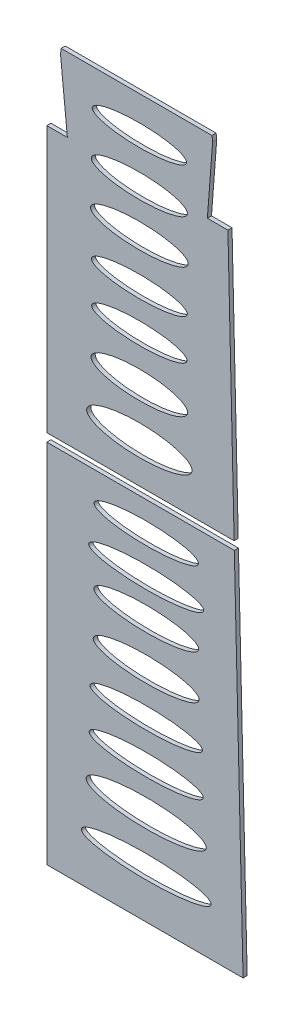
ISO-10303-21;
HEADER;
FILE_DESCRIPTION(('STEP AP214'),'2;1');
FILE_NAME('part.step','',(''),(''),'','','');
FILE_SCHEMA(('AUTOMOTIVE_DESIGN { 1 0 10303 214 1 1 1 1 }'));
ENDSEC;
DATA;
#1=APPLICATION_CONTEXT('core data for automotive mechanical design processes');
#2=APPLICATION_PROTOCOL_DEFINITION('international standard','automotive_design',2000,#1);
#3=PRODUCT_CONTEXT('',#1,'mechanical');
#4=PRODUCT('Part','Part','',(#3));
#5=PRODUCT_RELATED_PRODUCT_CATEGORY('part','',(#4));
#6=PRODUCT_DEFINITION_FORMATION('','',#4);
#7=PRODUCT_DEFINITION_CONTEXT('part definition',#1,'design');
#8=PRODUCT_DEFINITION('design','',#6,#7);
#9=PRODUCT_DEFINITION_SHAPE('','',#8);
#10=(LENGTH_UNIT() NAMED_UNIT(*) SI_UNIT(.MILLI.,.METRE.));
#11=(NAMED_UNIT(*) PLANE_ANGLE_UNIT() SI_UNIT($,.RADIAN.));
#12=(NAMED_UNIT(*) SI_UNIT($,.STERADIAN.) SOLID_ANGLE_UNIT());
#13=UNCERTAINTY_MEASURE_WITH_UNIT(LENGTH_MEASURE(1.E-05),#10,'distance_accuracy_value','');
#14=(GEOMETRIC_REPRESENTATION_CONTEXT(3) GLOBAL_UNCERTAINTY_ASSIGNED_CONTEXT((#13)) GLOBAL_UNIT_ASSIGNED_CONTEXT((#10,
#11,#12)) REPRESENTATION_CONTEXT('',''));
#15=CARTESIAN_POINT('',(0.,0.,0.));
#16=DIRECTION('',(0.,0.,1.));
#17=DIRECTION('',(1.,0.,0.));
#18=AXIS2_PLACEMENT_3D('',#15,#16,#17);
#19=CARTESIAN_POINT('',(0.,0.,1.));
#20=DIRECTION('',(0.,0.,1.));
#21=DIRECTION('',(1.,0.,0.));
#22=AXIS2_PLACEMENT_3D('',#19,#20,#21);
#23=PLANE('',#22);
#24=CARTESIAN_POINT('',(862.975707438958,434.995178452092,1.));
#25=DIRECTION('',(0.,0.,1.));
#26=DIRECTION('',(1.,0.,0.));
#27=AXIS2_PLACEMENT_3D('',#24,#25,#26);
#28=ELLIPSE('',#27,13.9830532100222,2.61364655121177);
#29=CARTESIAN_POINT('',(876.95876064898,434.995178452092,1.));
#30=VERTEX_POINT('',#29);
#31=EDGE_CURVE('E268',#30,#30,#28,.T.);
#32=ORIENTED_EDGE('',*,*,#31,.F.);
#33=EDGE_LOOP('',(#32));
#34=FACE_BOUND('',#33,.T.);
#35=CARTESIAN_POINT('',(862.975707438958,415.6470273338,1.));
#36=DIRECTION('',(0.,0.,1.));
#37=DIRECTION('',(1.,0.,0.));
#38=AXIS2_PLACEMENT_3D('',#35,#36,#37);
#39=ELLIPSE('',#38,12.8808034935591,3.01593561511254);
#40=CARTESIAN_POINT('',(875.856510932517,415.6470273338,1.));
#41=VERTEX_POINT('',#40);
#42=EDGE_CURVE('E282',#41,#41,#39,.T.);
#43=ORIENTED_EDGE('',*,*,#42,.F.);
#44=EDGE_LOOP('',(#43));
#45=FACE_BOUND('',#44,.T.);
#46=CARTESIAN_POINT('',(862.975707438958,395.521697163773,1.));
#47=DIRECTION('',(0.,0.,1.));
#48=DIRECTION('',(1.,0.,0.));
#49=AXIS2_PLACEMENT_3D('',#46,#47,#48);
#50=ELLIPSE('',#49,13.8738773083879,2.62037199849335);
#51=CARTESIAN_POINT('',(876.849584747345,395.521697163773,1.));
#52=VERTEX_POINT('',#51);
#53=EDGE_CURVE('E295',#52,#52,#50,.T.);
#54=ORIENTED_EDGE('',*,*,#53,.F.);
#55=EDGE_LOOP('',(#54));
#56=FACE_BOUND('',#55,.T.);
#57=CARTESIAN_POINT('',(862.975707438958,374.024304204855,1.));
#58=DIRECTION('',(0.,0.,1.));
#59=DIRECTION('',(1.,0.,0.));
#60=AXIS2_PLACEMENT_3D('',#57,#58,#59);
#61=ELLIPSE('',#60,15.7880718853903,2.79830838861017);
#62=CARTESIAN_POINT('',(878.763779324348,374.024304204855,1.));
#63=VERTEX_POINT('',#62);
#64=EDGE_CURVE('E110',#63,#63,#61,.T.);
#65=ORIENTED_EDGE('',*,*,#64,.F.);
#66=EDGE_LOOP('',(#65));
#67=FACE_BOUND('',#66,.T.);
#68=DIRECTION('',(1.,0.,0.));
#69=VECTOR('',#68,1.);
#70=CARTESIAN_POINT('',(838.812072799389,362.379421787543,1.));
#71=LINE('',#70,#69);
#72=CARTESIAN_POINT('',(838.812072799389,362.379421787543,1.));
#73=VERTEX_POINT('',#72);
#74=CARTESIAN_POINT('',(886.535705870808,362.379421787543,1.));
#75=VERTEX_POINT('',#74);
#76=EDGE_CURVE('E95',#73,#75,#71,.T.);
#77=ORIENTED_EDGE('',*,*,#76,.T.);
#78=DIRECTION('',(-0.0238917087800385,0.999714552385615,0.));
#79=VECTOR('',#78,1.);
#80=CARTESIAN_POINT('',(886.535705870808,362.379421787543,1.));
#81=LINE('',#80,#79);
#82=CARTESIAN_POINT('',(884.409069414916,451.365497759022,1.));
#83=VERTEX_POINT('',#82);
#84=EDGE_CURVE('E90',#75,#83,#81,.T.);
#85=ORIENTED_EDGE('',*,*,#84,.T.);
#86=DIRECTION('',(-1.,0.,0.));
#87=VECTOR('',#86,1.);
#88=CARTESIAN_POINT('',(884.409069414916,451.365497759022,1.));
#89=LINE('',#88,#87);
#90=CARTESIAN_POINT('',(838.812318941747,451.365497759022,1.));
#91=VERTEX_POINT('',#90);
#92=EDGE_CURVE('E93',#83,#91,#89,.T.);
#93=ORIENTED_EDGE('',*,*,#92,.T.);
#94=DIRECTION('',(-2.76607722209507E-06,-0.999999999996174,0.));
#95=VECTOR('',#94,1.);
#96=CARTESIAN_POINT('',(838.812072799389,362.379421787543,1.));
#97=LINE('',#96,#95);
#98=EDGE_CURVE('E60',#91,#73,#97,.T.);
#99=ORIENTED_EDGE('',*,*,#98,.T.);
#100=EDGE_LOOP('',(#77,#85,#93,#99));
#101=FACE_BOUND('',#100,.T.);
#102=CARTESIAN_POINT('',(862.975707438958,385.320756749994,1.));
#103=DIRECTION('',(0.,0.,1.));
#104=DIRECTION('',(1.,0.,0.));
#105=AXIS2_PLACEMENT_3D('',#102,#103,#104);
#106=ELLIPSE('',#105,14.6150565575408,3.34415845608782);
#107=CARTESIAN_POINT('',(877.590763996498,385.320756749994,1.));
#108=VERTEX_POINT('',#107);
#109=EDGE_CURVE('E125',#108,#108,#106,.T.);
#110=ORIENTED_EDGE('',*,*,#109,.F.);
#111=EDGE_LOOP('',(#110));
#112=FACE_BOUND('',#111,.T.);
#113=CARTESIAN_POINT('',(862.975707438958,405.3772390779,1.));
#114=DIRECTION('',(0.,0.,1.));
#115=DIRECTION('',(1.,0.,0.));
#116=AXIS2_PLACEMENT_3D('',#113,#114,#115);
#117=ELLIPSE('',#116,13.6744853111377,2.59591344071669);
#118=CARTESIAN_POINT('',(876.650192750095,405.3772390779,1.));
#119=VERTEX_POINT('',#118);
#120=EDGE_CURVE('E288',#119,#119,#117,.T.);
#121=ORIENTED_EDGE('',*,*,#120,.F.);
#122=EDGE_LOOP('',(#121));
#123=FACE_BOUND('',#122,.T.);
#124=CARTESIAN_POINT('',(862.975707438958,426.248778857751,1.));
#125=DIRECTION('',(0.,0.,1.));
#126=DIRECTION('',(1.,0.,0.));
#127=AXIS2_PLACEMENT_3D('',#124,#125,#126);
#128=ELLIPSE('',#127,12.7480455971727,2.90946544225518);
#129=CARTESIAN_POINT('',(875.72375303613,426.248778857751,1.));
#130=VERTEX_POINT('',#129);
#131=EDGE_CURVE('E275',#130,#130,#128,.T.);
#132=ORIENTED_EDGE('',*,*,#131,.F.);
#133=EDGE_LOOP('',(#132));
#134=FACE_BOUND('',#133,.T.);
#135=CARTESIAN_POINT('',(862.975707438958,444.248932303623,1.));
#136=DIRECTION('',(0.,0.,1.));
#137=DIRECTION('',(1.,0.,0.));
#138=AXIS2_PLACEMENT_3D('',#135,#136,#137);
#139=ELLIPSE('',#138,12.6879669571899,2.61364655121177);
#140=CARTESIAN_POINT('',(875.663674396148,444.248932303623,1.));
#141=VERTEX_POINT('',#140);
#142=EDGE_CURVE('E262',#141,#141,#139,.T.);
#143=ORIENTED_EDGE('',*,*,#142,.F.);
#144=EDGE_LOOP('',(#143));
#145=FACE_BOUND('',#144,.T.);
#146=ADVANCED_FACE('F43',(#34,#45,#56,#67,#101,#112,#123,#134,#145),#23,.T.);
#147=CARTESIAN_POINT('',(0.,0.,0.));
#148=DIRECTION('',(0.,0.,1.));
#149=DIRECTION('',(1.,0.,0.));
#150=AXIS2_PLACEMENT_3D('',#147,#148,#149);
#151=PLANE('',#150);
#152=DIRECTION('',(1.,0.,0.));
#153=VECTOR('',#152,1.);
#154=CARTESIAN_POINT('',(838.812072799389,362.379421787543,0.));
#155=LINE('',#154,#153);
#156=CARTESIAN_POINT('',(838.812072799389,362.379421787543,0.));
#157=VERTEX_POINT('',#156);
#158=CARTESIAN_POINT('',(886.535705870808,362.379421787543,0.));
#159=VERTEX_POINT('',#158);
#160=EDGE_CURVE('E107',#157,#159,#155,.T.);
#161=ORIENTED_EDGE('',*,*,#160,.F.);
#162=DIRECTION('',(-2.76607722209507E-06,-0.999999999996174,0.));
#163=VECTOR('',#162,1.);
#164=CARTESIAN_POINT('',(838.812072799389,362.379421787543,0.));
#165=LINE('',#164,#163);
#166=CARTESIAN_POINT('',(838.812318941747,451.365497759022,0.));
#167=VERTEX_POINT('',#166);
#168=EDGE_CURVE('E83',#167,#157,#165,.T.);
#169=ORIENTED_EDGE('',*,*,#168,.F.);
#170=DIRECTION('',(-1.,0.,0.));
#171=VECTOR('',#170,1.);
#172=CARTESIAN_POINT('',(884.409069414916,451.365497759022,0.));
#173=LINE('',#172,#171);
#174=CARTESIAN_POINT('',(884.409069414916,451.365497759022,0.));
#175=VERTEX_POINT('',#174);
#176=EDGE_CURVE('E77',#175,#167,#173,.T.);
#177=ORIENTED_EDGE('',*,*,#176,.F.);
#178=DIRECTION('',(-0.0238917087800385,0.999714552385615,0.));
#179=VECTOR('',#178,1.);
#180=CARTESIAN_POINT('',(886.535705870808,362.379421787543,0.));
#181=LINE('',#180,#179);
#182=EDGE_CURVE('E99',#159,#175,#181,.T.);
#183=ORIENTED_EDGE('',*,*,#182,.F.);
#184=EDGE_LOOP('',(#161,#169,#177,#183));
#185=FACE_BOUND('',#184,.T.);
#186=CARTESIAN_POINT('',(862.975707438958,374.024304204855,0.));
#187=DIRECTION('',(0.,0.,1.));
#188=DIRECTION('',(1.,0.,0.));
#189=AXIS2_PLACEMENT_3D('',#186,#187,#188);
#190=ELLIPSE('',#189,15.7880718853903,2.79830838861017);
#191=CARTESIAN_POINT('',(878.763779324348,374.024304204855,0.));
#192=VERTEX_POINT('',#191);
#193=EDGE_CURVE('E122',#192,#192,#190,.T.);
#194=ORIENTED_EDGE('',*,*,#193,.T.);
#195=EDGE_LOOP('',(#194));
#196=FACE_BOUND('',#195,.T.);
#197=CARTESIAN_POINT('',(862.975707438958,385.320756749994,0.));
#198=DIRECTION('',(0.,0.,1.));
#199=DIRECTION('',(1.,0.,0.));
#200=AXIS2_PLACEMENT_3D('',#197,#198,#199);
#201=ELLIPSE('',#200,14.6150565575408,3.34415845608782);
#202=CARTESIAN_POINT('',(877.590763996498,385.320756749994,0.));
#203=VERTEX_POINT('',#202);
#204=EDGE_CURVE('E129',#203,#203,#201,.T.);
#205=ORIENTED_EDGE('',*,*,#204,.T.);
#206=EDGE_LOOP('',(#205));
#207=FACE_BOUND('',#206,.T.);
#208=CARTESIAN_POINT('',(862.975707438958,395.521697163773,0.));
#209=DIRECTION('',(0.,0.,1.));
#210=DIRECTION('',(1.,0.,0.));
#211=AXIS2_PLACEMENT_3D('',#208,#209,#210);
#212=ELLIPSE('',#211,13.8738773083879,2.62037199849335);
#213=CARTESIAN_POINT('',(876.849584747345,395.521697163773,0.));
#214=VERTEX_POINT('',#213);
#215=EDGE_CURVE('E292',#214,#214,#212,.T.);
#216=ORIENTED_EDGE('',*,*,#215,.T.);
#217=EDGE_LOOP('',(#216));
#218=FACE_BOUND('',#217,.T.);
#219=CARTESIAN_POINT('',(862.975707438958,405.3772390779,0.));
#220=DIRECTION('',(0.,0.,1.));
#221=DIRECTION('',(1.,0.,0.));
#222=AXIS2_PLACEMENT_3D('',#219,#220,#221);
#223=ELLIPSE('',#222,13.6744853111377,2.59591344071669);
#224=CARTESIAN_POINT('',(876.650192750095,405.3772390779,0.));
#225=VERTEX_POINT('',#224);
#226=EDGE_CURVE('E286',#225,#225,#223,.T.);
#227=ORIENTED_EDGE('',*,*,#226,.T.);
#228=EDGE_LOOP('',(#227));
#229=FACE_BOUND('',#228,.T.);
#230=CARTESIAN_POINT('',(862.975707438958,415.6470273338,0.));
#231=DIRECTION('',(0.,0.,1.));
#232=DIRECTION('',(1.,0.,0.));
#233=AXIS2_PLACEMENT_3D('',#230,#231,#232);
#234=ELLIPSE('',#233,12.8808034935591,3.01593561511254);
#235=CARTESIAN_POINT('',(875.856510932517,415.6470273338,0.));
#236=VERTEX_POINT('',#235);
#237=EDGE_CURVE('E279',#236,#236,#234,.T.);
#238=ORIENTED_EDGE('',*,*,#237,.T.);
#239=EDGE_LOOP('',(#238));
#240=FACE_BOUND('',#239,.T.);
#241=CARTESIAN_POINT('',(862.975707438958,426.248778857751,0.));
#242=DIRECTION('',(0.,0.,1.));
#243=DIRECTION('',(1.,0.,0.));
#244=AXIS2_PLACEMENT_3D('',#241,#242,#243);
#245=ELLIPSE('',#244,12.7480455971727,2.90946544225518);
#246=CARTESIAN_POINT('',(875.72375303613,426.248778857751,0.));
#247=VERTEX_POINT('',#246);
#248=EDGE_CURVE('E272',#247,#247,#245,.T.);
#249=ORIENTED_EDGE('',*,*,#248,.T.);
#250=EDGE_LOOP('',(#249));
#251=FACE_BOUND('',#250,.T.);
#252=CARTESIAN_POINT('',(862.975707438958,434.995178452092,0.));
#253=DIRECTION('',(0.,0.,1.));
#254=DIRECTION('',(1.,0.,0.));
#255=AXIS2_PLACEMENT_3D('',#252,#253,#254);
#256=ELLIPSE('',#255,13.9830532100222,2.61364655121177);
#257=CARTESIAN_POINT('',(876.95876064898,434.995178452092,0.));
#258=VERTEX_POINT('',#257);
#259=EDGE_CURVE('E265',#258,#258,#256,.T.);
#260=ORIENTED_EDGE('',*,*,#259,.T.);
#261=EDGE_LOOP('',(#260));
#262=FACE_BOUND('',#261,.T.);
#263=CARTESIAN_POINT('',(862.975707438958,444.248932303623,0.));
#264=DIRECTION('',(0.,0.,1.));
#265=DIRECTION('',(1.,0.,0.));
#266=AXIS2_PLACEMENT_3D('',#263,#264,#265);
#267=ELLIPSE('',#266,12.6879669571899,2.61364655121177);
#268=CARTESIAN_POINT('',(875.663674396148,444.248932303623,0.));
#269=VERTEX_POINT('',#268);
#270=EDGE_CURVE('E266',#269,#269,#267,.T.);
#271=ORIENTED_EDGE('',*,*,#270,.T.);
#272=EDGE_LOOP('',(#271));
#273=FACE_BOUND('',#272,.T.);
#274=ADVANCED_FACE('F118',(#185,#196,#207,#218,#229,#240,#251,#262,#273),#151,.F.);
#275=CARTESIAN_POINT('',(838.812072799389,362.379421787543,1.));
#276=DIRECTION('',(0.,1.,0.));
#277=DIRECTION('',(0.,0.,1.));
#278=AXIS2_PLACEMENT_3D('',#275,#276,#277);
#279=PLANE('',#278);
#280=ORIENTED_EDGE('',*,*,#160,.T.);
#281=DIRECTION('',(0.,0.,-1.));
#282=VECTOR('',#281,1.);
#283=CARTESIAN_POINT('',(886.535705870808,362.379421787543,1.));
#284=LINE('',#283,#282);
#285=EDGE_CURVE('E12',#75,#159,#284,.T.);
#286=ORIENTED_EDGE('',*,*,#285,.F.);
#287=ORIENTED_EDGE('',*,*,#76,.F.);
#288=DIRECTION('',(0.,0.,-1.));
#289=VECTOR('',#288,1.);
#290=CARTESIAN_POINT('',(838.812072799389,362.379421787543,1.));
#291=LINE('',#290,#289);
#292=EDGE_CURVE('E103',#73,#157,#291,.T.);
#293=ORIENTED_EDGE('',*,*,#292,.T.);
#294=EDGE_LOOP('',(#280,#286,#287,#293));
#295=FACE_BOUND('',#294,.T.);
#296=ADVANCED_FACE('F45',(#295),#279,.F.);
#297=CARTESIAN_POINT('',(886.535705870808,362.379421787543,1.));
#298=DIRECTION('',(-0.999714552385615,-0.0238917087800385,0.));
#299=DIRECTION('',(0.0238917087800385,-0.999714552385615,0.));
#300=AXIS2_PLACEMENT_3D('',#297,#298,#299);
#301=PLANE('',#300);
#302=ORIENTED_EDGE('',*,*,#182,.T.);
#303=DIRECTION('',(0.,0.,-1.));
#304=VECTOR('',#303,1.);
#305=CARTESIAN_POINT('',(884.409069414916,451.365497759022,1.));
#306=LINE('',#305,#304);
#307=EDGE_CURVE('E52',#83,#175,#306,.T.);
#308=ORIENTED_EDGE('',*,*,#307,.F.);
#309=ORIENTED_EDGE('',*,*,#84,.F.);
#310=ORIENTED_EDGE('',*,*,#285,.T.);
#311=EDGE_LOOP('',(#302,#308,#309,#310));
#312=FACE_BOUND('',#311,.T.);
#313=ADVANCED_FACE('F98',(#312),#301,.F.);
#314=CARTESIAN_POINT('',(884.409069414916,451.365497759022,1.));
#315=DIRECTION('',(0.,-1.,0.));
#316=DIRECTION('',(0.,0.,-1.));
#317=AXIS2_PLACEMENT_3D('',#314,#315,#316);
#318=PLANE('',#317);
#319=ORIENTED_EDGE('',*,*,#176,.T.);
#320=DIRECTION('',(0.,0.,-1.));
#321=VECTOR('',#320,1.);
#322=CARTESIAN_POINT('',(838.812318941747,451.365497759022,1.));
#323=LINE('',#322,#321);
#324=EDGE_CURVE('E100',#91,#167,#323,.T.);
#325=ORIENTED_EDGE('',*,*,#324,.F.);
#326=ORIENTED_EDGE('',*,*,#92,.F.);
#327=ORIENTED_EDGE('',*,*,#307,.T.);
#328=EDGE_LOOP('',(#319,#325,#326,#327));
#329=FACE_BOUND('',#328,.T.);
#330=ADVANCED_FACE('F101',(#329),#318,.F.);
#331=CARTESIAN_POINT('',(838.812072799389,362.379421787543,1.));
#332=DIRECTION('',(0.999999999996174,-2.76607722209507E-06,0.));
#333=DIRECTION('',(2.76607722209507E-06,0.999999999996175,0.));
#334=AXIS2_PLACEMENT_3D('',#331,#332,#333);
#335=PLANE('',#334);
#336=ORIENTED_EDGE('',*,*,#168,.T.);
#337=ORIENTED_EDGE('',*,*,#292,.F.);
#338=ORIENTED_EDGE('',*,*,#98,.F.);
#339=ORIENTED_EDGE('',*,*,#324,.T.);
#340=EDGE_LOOP('',(#336,#337,#338,#339));
#341=FACE_BOUND('',#340,.T.);
#342=ADVANCED_FACE('F115',(#341),#335,.F.);
#343=DIRECTION('',(0.,0.,-1.));
#344=VECTOR('',#343,1.);
#345=SURFACE_OF_LINEAR_EXTRUSION('',#61,#344);
#346=ORIENTED_EDGE('',*,*,#64,.T.);
#347=EDGE_LOOP('',(#346));
#348=FACE_BOUND('',#347,.T.);
#349=ORIENTED_EDGE('',*,*,#193,.F.);
#350=EDGE_LOOP('',(#349));
#351=FACE_BOUND('',#350,.T.);
#352=ADVANCED_FACE('F132',(#348,#351),#345,.T.);
#353=DIRECTION('',(0.,0.,-1.));
#354=VECTOR('',#353,1.);
#355=SURFACE_OF_LINEAR_EXTRUSION('',#106,#354);
#356=ORIENTED_EDGE('',*,*,#109,.T.);
#357=EDGE_LOOP('',(#356));
#358=FACE_BOUND('',#357,.T.);
#359=ORIENTED_EDGE('',*,*,#204,.F.);
#360=EDGE_LOOP('',(#359));
#361=FACE_BOUND('',#360,.T.);
#362=ADVANCED_FACE('F136',(#358,#361),#355,.T.);
#363=DIRECTION('',(0.,0.,-1.));
#364=VECTOR('',#363,1.);
#365=SURFACE_OF_LINEAR_EXTRUSION('',#50,#364);
#366=ORIENTED_EDGE('',*,*,#53,.T.);
#367=EDGE_LOOP('',(#366));
#368=FACE_BOUND('',#367,.T.);
#369=ORIENTED_EDGE('',*,*,#215,.F.);
#370=EDGE_LOOP('',(#369));
#371=FACE_BOUND('',#370,.T.);
#372=ADVANCED_FACE('F194',(#368,#371),#365,.T.);
#373=DIRECTION('',(0.,0.,-1.));
#374=VECTOR('',#373,1.);
#375=SURFACE_OF_LINEAR_EXTRUSION('',#117,#374);
#376=ORIENTED_EDGE('',*,*,#120,.T.);
#377=EDGE_LOOP('',(#376));
#378=FACE_BOUND('',#377,.T.);
#379=ORIENTED_EDGE('',*,*,#226,.F.);
#380=EDGE_LOOP('',(#379));
#381=FACE_BOUND('',#380,.T.);
#382=ADVANCED_FACE('F202',(#378,#381),#375,.T.);
#383=DIRECTION('',(0.,0.,-1.));
#384=VECTOR('',#383,1.);
#385=SURFACE_OF_LINEAR_EXTRUSION('',#39,#384);
#386=ORIENTED_EDGE('',*,*,#42,.T.);
#387=EDGE_LOOP('',(#386));
#388=FACE_BOUND('',#387,.T.);
#389=ORIENTED_EDGE('',*,*,#237,.F.);
#390=EDGE_LOOP('',(#389));
#391=FACE_BOUND('',#390,.T.);
#392=ADVANCED_FACE('F210',(#388,#391),#385,.T.);
#393=DIRECTION('',(0.,0.,-1.));
#394=VECTOR('',#393,1.);
#395=SURFACE_OF_LINEAR_EXTRUSION('',#128,#394);
#396=ORIENTED_EDGE('',*,*,#131,.T.);
#397=EDGE_LOOP('',(#396));
#398=FACE_BOUND('',#397,.T.);
#399=ORIENTED_EDGE('',*,*,#248,.F.);
#400=EDGE_LOOP('',(#399));
#401=FACE_BOUND('',#400,.T.);
#402=ADVANCED_FACE('F219',(#398,#401),#395,.T.);
#403=DIRECTION('',(0.,0.,-1.));
#404=VECTOR('',#403,1.);
#405=SURFACE_OF_LINEAR_EXTRUSION('',#28,#404);
#406=ORIENTED_EDGE('',*,*,#31,.T.);
#407=EDGE_LOOP('',(#406));
#408=FACE_BOUND('',#407,.T.);
#409=ORIENTED_EDGE('',*,*,#259,.F.);
#410=EDGE_LOOP('',(#409));
#411=FACE_BOUND('',#410,.T.);
#412=ADVANCED_FACE('F228',(#408,#411),#405,.T.);
#413=DIRECTION('',(0.,0.,-1.));
#414=VECTOR('',#413,1.);
#415=SURFACE_OF_LINEAR_EXTRUSION('',#139,#414);
#416=ORIENTED_EDGE('',*,*,#142,.T.);
#417=EDGE_LOOP('',(#416));
#418=FACE_BOUND('',#417,.T.);
#419=ORIENTED_EDGE('',*,*,#270,.F.);
#420=EDGE_LOOP('',(#419));
#421=FACE_BOUND('',#420,.T.);
#422=ADVANCED_FACE('F237',(#418,#421),#415,.T.);
#423=CLOSED_SHELL('',(#146,#274,#296,#313,#330,#342,#352,#362,#372,#382,#392,#402,#412,#422));
#424=MANIFOLD_SOLID_BREP('B2',#423);
#425=CARTESIAN_POINT('',(0.,0.,1.));
#426=DIRECTION('',(0.,0.,-1.));
#427=DIRECTION('',(-1.,0.,0.));
#428=AXIS2_PLACEMENT_3D('',#425,#426,#427);
#429=PLANE('',#428);
#430=DIRECTION('',(-3.84853629849299E-06,-0.999999999992594,0.));
#431=VECTOR('',#430,1.);
#432=CARTESIAN_POINT('',(838.812318941747,453.365497759022,1.));
#433=LINE('',#432,#431);
#434=CARTESIAN_POINT('',(838.812567804722,518.029815691744,1.));
#435=VERTEX_POINT('',#434);
#436=CARTESIAN_POINT('',(838.812318941747,453.365497759022,1.));
#437=VERTEX_POINT('',#436);
#438=EDGE_CURVE('E471',#435,#437,#433,.T.);
#439=ORIENTED_EDGE('',*,*,#438,.T.);
#440=DIRECTION('',(1.,0.,0.));
#441=VECTOR('',#440,1.);
#442=CARTESIAN_POINT('',(838.812318941747,453.365497759022,1.));
#443=LINE('',#442,#441);
#444=CARTESIAN_POINT('',(884.36126510006,453.365497759022,1.));
#445=VERTEX_POINT('',#444);
#446=EDGE_CURVE('E409',#437,#445,#443,.T.);
#447=ORIENTED_EDGE('',*,*,#446,.T.);
#448=DIRECTION('',(-0.0233276513502761,0.999727873314774,0.));
#449=VECTOR('',#448,1.);
#450=CARTESIAN_POINT('',(884.36126510006,453.365497759022,1.));
#451=LINE('',#450,#449);
#452=CARTESIAN_POINT('',(882.852260834668,518.035258225299,1.));
#453=VERTEX_POINT('',#452);
#454=EDGE_CURVE('E492',#445,#453,#451,.T.);
#455=ORIENTED_EDGE('',*,*,#454,.T.);
#456=DIRECTION('',(-1.,0.,0.));
#457=VECTOR('',#456,1.);
#458=CARTESIAN_POINT('',(882.852260834668,518.035258225299,1.));
#459=LINE('',#458,#457);
#460=CARTESIAN_POINT('',(877.852260834668,518.035258225299,1.));
#461=VERTEX_POINT('',#460);
#462=EDGE_CURVE('E511',#453,#461,#459,.T.);
#463=ORIENTED_EDGE('',*,*,#462,.T.);
#464=DIRECTION('',(0.07646866005489,0.997071985379897,0.));
#465=VECTOR('',#464,1.);
#466=CARTESIAN_POINT('',(877.852260834668,518.035258225299,1.));
#467=LINE('',#466,#465);
#468=CARTESIAN_POINT('',(879.13803426784,534.800409711427,1.));
#469=VERTEX_POINT('',#468);
#470=EDGE_CURVE('E508',#461,#469,#467,.T.);
#471=ORIENTED_EDGE('',*,*,#470,.T.);
#472=DIRECTION('',(-0.131266834998909,0.991347072436979,0.));
#473=VECTOR('',#472,1.);
#474=CARTESIAN_POINT('',(878.975245435611,536.029815693956,1.));
#475=LINE('',#474,#473);
#476=CARTESIAN_POINT('',(878.975245435611,536.029815693956,1.));
#477=VERTEX_POINT('',#476);
#478=EDGE_CURVE('E510',#469,#477,#475,.T.);
#479=ORIENTED_EDGE('',*,*,#478,.T.);
#480=DIRECTION('',(-1.,0.,0.));
#481=VECTOR('',#480,1.);
#482=CARTESIAN_POINT('',(842.299167643456,536.029815693956,1.));
#483=LINE('',#482,#481);
#484=CARTESIAN_POINT('',(842.299167643456,536.029815693956,1.));
#485=VERTEX_POINT('',#484);
#486=EDGE_CURVE('E434',#477,#485,#483,.T.);
#487=ORIENTED_EDGE('',*,*,#486,.T.);
#488=DIRECTION('',(-0.119797622257236,-0.992798332845857,0.));
#489=VECTOR('',#488,1.);
#490=CARTESIAN_POINT('',(842.299167643456,536.029815693956,1.));
#491=LINE('',#490,#489);
#492=CARTESIAN_POINT('',(842.142482059304,534.731315909102,1.));
#493=VERTEX_POINT('',#492);
#494=EDGE_CURVE('E428',#485,#493,#491,.T.);
#495=ORIENTED_EDGE('',*,*,#494,.T.);
#496=DIRECTION('',(0.0994999274980076,-0.995037569354992,0.));
#497=VECTOR('',#496,1.);
#498=CARTESIAN_POINT('',(843.812567804722,518.029815691744,1.));
#499=LINE('',#498,#497);
#500=CARTESIAN_POINT('',(843.812567804722,518.029815691744,1.));
#501=VERTEX_POINT('',#500);
#502=EDGE_CURVE('E432',#493,#501,#499,.T.);
#503=ORIENTED_EDGE('',*,*,#502,.T.);
#504=DIRECTION('',(-1.,0.,0.));
#505=VECTOR('',#504,1.);
#506=CARTESIAN_POINT('',(838.812567804722,518.029815691744,1.));
#507=LINE('',#506,#505);
#508=EDGE_CURVE('E360',#501,#435,#507,.T.);
#509=ORIENTED_EDGE('',*,*,#508,.T.);
#510=EDGE_LOOP('',(#439,#447,#455,#463,#471,#479,#487,#495,#503,#509));
#511=FACE_BOUND('',#510,.T.);
#512=CARTESIAN_POINT('',(861.31300320964,463.034689480063,1.));
#513=DIRECTION('',(0.,0.,1.));
#514=DIRECTION('',(1.,0.,0.));
#515=AXIS2_PLACEMENT_3D('',#512,#513,#514);
#516=ELLIPSE('',#515,12.8107935266144,3.67694478518754);
#517=CARTESIAN_POINT('',(874.123796736254,463.034689480063,1.));
#518=VERTEX_POINT('',#517);
#519=EDGE_CURVE('E456',#518,#518,#516,.T.);
#520=ORIENTED_EDGE('',*,*,#519,.F.);
#521=EDGE_LOOP('',(#520));
#522=FACE_BOUND('',#521,.T.);
#523=CARTESIAN_POINT('',(861.31300320964,474.69660634801,1.));
#524=DIRECTION('',(0.,0.,1.));
#525=DIRECTION('',(1.,0.,0.));
#526=AXIS2_PLACEMENT_3D('',#523,#524,#525);
#527=ELLIPSE('',#526,11.7354722302953,3.34415845608782);
#528=CARTESIAN_POINT('',(873.048475439935,474.69660634801,1.));
#529=VERTEX_POINT('',#528);
#530=EDGE_CURVE('E522',#529,#529,#527,.T.);
#531=ORIENTED_EDGE('',*,*,#530,.F.);
#532=EDGE_LOOP('',(#531));
#533=FACE_BOUND('',#532,.T.);
#534=CARTESIAN_POINT('',(861.31300320964,485.576051894971,1.));
#535=DIRECTION('',(0.,0.,1.));
#536=DIRECTION('',(1.,0.,0.));
#537=AXIS2_PLACEMENT_3D('',#534,#535,#536);
#538=ELLIPSE('',#537,11.5875916314871,2.62037199849335);
#539=CARTESIAN_POINT('',(872.900594841127,485.576051894971,1.));
#540=VERTEX_POINT('',#539);
#541=EDGE_CURVE('E734',#540,#540,#538,.T.);
#542=ORIENTED_EDGE('',*,*,#541,.F.);
#543=EDGE_LOOP('',(#542));
#544=FACE_BOUND('',#543,.T.);
#545=CARTESIAN_POINT('',(861.31300320964,495.407135251323,1.));
#546=DIRECTION('',(0.,0.,1.));
#547=DIRECTION('',(1.,0.,0.));
#548=AXIS2_PLACEMENT_3D('',#545,#546,#547);
#549=ELLIPSE('',#548,11.665285619194,2.59591344071669);
#550=CARTESIAN_POINT('',(872.978288828834,495.407135251323,1.));
#551=VERTEX_POINT('',#550);
#552=EDGE_CURVE('E728',#551,#551,#549,.T.);
#553=ORIENTED_EDGE('',*,*,#552,.F.);
#554=EDGE_LOOP('',(#553));
#555=FACE_BOUND('',#554,.T.);
#556=CARTESIAN_POINT('',(861.31300320964,506.096945681619,1.));
#557=DIRECTION('',(0.,0.,1.));
#558=DIRECTION('',(1.,0.,0.));
#559=AXIS2_PLACEMENT_3D('',#556,#557,#558);
#560=ELLIPSE('',#559,11.891821934998,3.01593561511249);
#561=CARTESIAN_POINT('',(873.204825144638,506.096945681619,1.));
#562=VERTEX_POINT('',#561);
#563=EDGE_CURVE('E721',#562,#562,#560,.T.);
#564=ORIENTED_EDGE('',*,*,#563,.F.);
#565=EDGE_LOOP('',(#564));
#566=FACE_BOUND('',#565,.T.);
#567=CARTESIAN_POINT('',(861.31300320964,516.592227032709,1.));
#568=DIRECTION('',(0.,0.,1.));
#569=DIRECTION('',(1.,0.,0.));
#570=AXIS2_PLACEMENT_3D('',#567,#568,#569);
#571=ELLIPSE('',#570,11.6935192433739,2.90946544225512);
#572=CARTESIAN_POINT('',(873.006522453014,516.592227032709,1.));
#573=VERTEX_POINT('',#572);
#574=EDGE_CURVE('E714',#573,#573,#571,.T.);
#575=ORIENTED_EDGE('',*,*,#574,.F.);
#576=EDGE_LOOP('',(#575));
#577=FACE_BOUND('',#576,.T.);
#578=CARTESIAN_POINT('',(861.31300320964,527.26141130087,1.));
#579=DIRECTION('',(0.,0.,1.));
#580=DIRECTION('',(1.,0.,0.));
#581=AXIS2_PLACEMENT_3D('',#578,#579,#580);
#582=ELLIPSE('',#581,11.4675521142926,2.61364655121177);
#583=CARTESIAN_POINT('',(872.780555323933,527.26141130087,1.));
#584=VERTEX_POINT('',#583);
#585=EDGE_CURVE('E708',#584,#584,#582,.T.);
#586=ORIENTED_EDGE('',*,*,#585,.F.);
#587=EDGE_LOOP('',(#586));
#588=FACE_BOUND('',#587,.T.);
#589=ADVANCED_FACE('F343',(#511,#522,#533,#544,#555,#566,#577,#588),#429,.F.);
#590=CARTESIAN_POINT('',(0.,0.,0.));
#591=DIRECTION('',(0.,0.,-1.));
#592=DIRECTION('',(-1.,0.,0.));
#593=AXIS2_PLACEMENT_3D('',#590,#591,#592);
#594=PLANE('',#593);
#595=CARTESIAN_POINT('',(861.31300320964,516.592227032709,0.));
#596=DIRECTION('',(0.,0.,1.));
#597=DIRECTION('',(1.,0.,0.));
#598=AXIS2_PLACEMENT_3D('',#595,#596,#597);
#599=ELLIPSE('',#598,11.6935192433739,2.90946544225512);
#600=CARTESIAN_POINT('',(873.006522453014,516.592227032709,0.));
#601=VERTEX_POINT('',#600);
#602=EDGE_CURVE('E711',#601,#601,#599,.T.);
#603=ORIENTED_EDGE('',*,*,#602,.T.);
#604=EDGE_LOOP('',(#603));
#605=FACE_BOUND('',#604,.T.);
#606=CARTESIAN_POINT('',(861.31300320964,495.407135251323,0.));
#607=DIRECTION('',(0.,0.,1.));
#608=DIRECTION('',(1.,0.,0.));
#609=AXIS2_PLACEMENT_3D('',#606,#607,#608);
#610=ELLIPSE('',#609,11.665285619194,2.59591344071669);
#611=CARTESIAN_POINT('',(872.978288828834,495.407135251323,0.));
#612=VERTEX_POINT('',#611);
#613=EDGE_CURVE('E725',#612,#612,#610,.T.);
#614=ORIENTED_EDGE('',*,*,#613,.T.);
#615=EDGE_LOOP('',(#614));
#616=FACE_BOUND('',#615,.T.);
#617=CARTESIAN_POINT('',(861.31300320964,474.69660634801,0.));
#618=DIRECTION('',(0.,0.,1.));
#619=DIRECTION('',(1.,0.,0.));
#620=AXIS2_PLACEMENT_3D('',#617,#618,#619);
#621=ELLIPSE('',#620,11.7354722302953,3.34415845608782);
#622=CARTESIAN_POINT('',(873.048475439935,474.69660634801,0.));
#623=VERTEX_POINT('',#622);
#624=EDGE_CURVE('E526',#623,#623,#621,.T.);
#625=ORIENTED_EDGE('',*,*,#624,.T.);
#626=EDGE_LOOP('',(#625));
#627=FACE_BOUND('',#626,.T.);
#628=DIRECTION('',(-3.84853629849299E-06,-0.999999999992594,0.));
#629=VECTOR('',#628,1.);
#630=CARTESIAN_POINT('',(838.812318941747,453.365497759022,0.));
#631=LINE('',#630,#629);
#632=CARTESIAN_POINT('',(838.812567804722,518.029815691744,0.));
#633=VERTEX_POINT('',#632);
#634=CARTESIAN_POINT('',(838.812318941747,453.365497759022,0.));
#635=VERTEX_POINT('',#634);
#636=EDGE_CURVE('E452',#633,#635,#631,.T.);
#637=ORIENTED_EDGE('',*,*,#636,.F.);
#638=DIRECTION('',(-1.,0.,0.));
#639=VECTOR('',#638,1.);
#640=CARTESIAN_POINT('',(838.812567804722,518.029815691744,0.));
#641=LINE('',#640,#639);
#642=CARTESIAN_POINT('',(843.812567804722,518.029815691744,0.));
#643=VERTEX_POINT('',#642);
#644=EDGE_CURVE('E401',#643,#633,#641,.T.);
#645=ORIENTED_EDGE('',*,*,#644,.F.);
#646=DIRECTION('',(0.0994999274980076,-0.995037569354992,0.));
#647=VECTOR('',#646,1.);
#648=CARTESIAN_POINT('',(843.812567804722,518.029815691744,0.));
#649=LINE('',#648,#647);
#650=CARTESIAN_POINT('',(842.142482059304,534.731315909102,0.));
#651=VERTEX_POINT('',#650);
#652=EDGE_CURVE('E395',#651,#643,#649,.T.);
#653=ORIENTED_EDGE('',*,*,#652,.F.);
#654=DIRECTION('',(-0.119797622257236,-0.992798332845857,0.));
#655=VECTOR('',#654,1.);
#656=CARTESIAN_POINT('',(842.299167643456,536.029815693956,0.));
#657=LINE('',#656,#655);
#658=CARTESIAN_POINT('',(842.299167643456,536.029815693956,0.));
#659=VERTEX_POINT('',#658);
#660=EDGE_CURVE('E442',#659,#651,#657,.T.);
#661=ORIENTED_EDGE('',*,*,#660,.F.);
#662=DIRECTION('',(-1.,0.,0.));
#663=VECTOR('',#662,1.);
#664=CARTESIAN_POINT('',(842.299167643456,536.029815693956,0.));
#665=LINE('',#664,#663);
#666=CARTESIAN_POINT('',(878.975245435611,536.029815693956,0.));
#667=VERTEX_POINT('',#666);
#668=EDGE_CURVE('E466',#667,#659,#665,.T.);
#669=ORIENTED_EDGE('',*,*,#668,.F.);
#670=DIRECTION('',(-0.131266834998909,0.991347072436979,0.));
#671=VECTOR('',#670,1.);
#672=CARTESIAN_POINT('',(878.975245435611,536.029815693956,0.));
#673=LINE('',#672,#671);
#674=CARTESIAN_POINT('',(879.13803426784,534.800409711427,0.));
#675=VERTEX_POINT('',#674);
#676=EDGE_CURVE('E464',#675,#667,#673,.T.);
#677=ORIENTED_EDGE('',*,*,#676,.F.);
#678=DIRECTION('',(0.07646866005489,0.997071985379897,0.));
#679=VECTOR('',#678,1.);
#680=CARTESIAN_POINT('',(877.852260834668,518.035258225299,0.));
#681=LINE('',#680,#679);
#682=CARTESIAN_POINT('',(877.852260834668,518.035258225299,0.));
#683=VERTEX_POINT('',#682);
#684=EDGE_CURVE('E462',#683,#675,#681,.T.);
#685=ORIENTED_EDGE('',*,*,#684,.F.);
#686=DIRECTION('',(-1.,0.,0.));
#687=VECTOR('',#686,1.);
#688=CARTESIAN_POINT('',(882.852260834668,518.035258225299,0.));
#689=LINE('',#688,#687);
#690=CARTESIAN_POINT('',(882.852260834668,518.035258225299,0.));
#691=VERTEX_POINT('',#690);
#692=EDGE_CURVE('E460',#691,#683,#689,.T.);
#693=ORIENTED_EDGE('',*,*,#692,.F.);
#694=DIRECTION('',(-0.0233276513502761,0.999727873314774,0.));
#695=VECTOR('',#694,1.);
#696=CARTESIAN_POINT('',(884.36126510006,453.365497759022,0.));
#697=LINE('',#696,#695);
#698=CARTESIAN_POINT('',(884.36126510006,453.365497759022,0.));
#699=VERTEX_POINT('',#698);
#700=EDGE_CURVE('E458',#699,#691,#697,.T.);
#701=ORIENTED_EDGE('',*,*,#700,.F.);
#702=DIRECTION('',(1.,0.,0.));
#703=VECTOR('',#702,1.);
#704=CARTESIAN_POINT('',(838.812318941747,453.365497759022,0.));
#705=LINE('',#704,#703);
#706=EDGE_CURVE('E455',#635,#699,#705,.T.);
#707=ORIENTED_EDGE('',*,*,#706,.F.);
#708=EDGE_LOOP('',(#637,#645,#653,#661,#669,#677,#685,#693,#701,#707));
#709=FACE_BOUND('',#708,.T.);
#710=CARTESIAN_POINT('',(861.31300320964,463.034689480063,0.));
#711=DIRECTION('',(0.,0.,1.));
#712=DIRECTION('',(1.,0.,0.));
#713=AXIS2_PLACEMENT_3D('',#710,#711,#712);
#714=ELLIPSE('',#713,12.8107935266144,3.67694478518754);
#715=CARTESIAN_POINT('',(874.123796736254,463.034689480063,0.));
#716=VERTEX_POINT('',#715);
#717=EDGE_CURVE('E519',#716,#716,#714,.T.);
#718=ORIENTED_EDGE('',*,*,#717,.T.);
#719=EDGE_LOOP('',(#718));
#720=FACE_BOUND('',#719,.T.);
#721=CARTESIAN_POINT('',(861.31300320964,485.576051894971,0.));
#722=DIRECTION('',(0.,0.,1.));
#723=DIRECTION('',(1.,0.,0.));
#724=AXIS2_PLACEMENT_3D('',#721,#722,#723);
#725=ELLIPSE('',#724,11.5875916314871,2.62037199849335);
#726=CARTESIAN_POINT('',(872.900594841127,485.576051894971,0.));
#727=VERTEX_POINT('',#726);
#728=EDGE_CURVE('E732',#727,#727,#725,.T.);
#729=ORIENTED_EDGE('',*,*,#728,.T.);
#730=EDGE_LOOP('',(#729));
#731=FACE_BOUND('',#730,.T.);
#732=CARTESIAN_POINT('',(861.31300320964,506.096945681619,0.));
#733=DIRECTION('',(0.,0.,1.));
#734=DIRECTION('',(1.,0.,0.));
#735=AXIS2_PLACEMENT_3D('',#732,#733,#734);
#736=ELLIPSE('',#735,11.891821934998,3.01593561511249);
#737=CARTESIAN_POINT('',(873.204825144638,506.096945681619,0.));
#738=VERTEX_POINT('',#737);
#739=EDGE_CURVE('E718',#738,#738,#736,.T.);
#740=ORIENTED_EDGE('',*,*,#739,.T.);
#741=EDGE_LOOP('',(#740));
#742=FACE_BOUND('',#741,.T.);
#743=CARTESIAN_POINT('',(861.31300320964,527.26141130087,0.));
#744=DIRECTION('',(0.,0.,1.));
#745=DIRECTION('',(1.,0.,0.));
#746=AXIS2_PLACEMENT_3D('',#743,#744,#745);
#747=ELLIPSE('',#746,11.4675521142926,2.61364655121177);
#748=CARTESIAN_POINT('',(872.780555323933,527.26141130087,0.));
#749=VERTEX_POINT('',#748);
#750=EDGE_CURVE('E712',#749,#749,#747,.T.);
#751=ORIENTED_EDGE('',*,*,#750,.T.);
#752=EDGE_LOOP('',(#751));
#753=FACE_BOUND('',#752,.T.);
#754=ADVANCED_FACE('F496',(#605,#616,#627,#709,#720,#731,#742,#753),#594,.T.);
#755=CARTESIAN_POINT('',(838.812318941747,453.365497759022,1.));
#756=DIRECTION('',(0.999999999992594,-3.84853629849299E-06,0.));
#757=DIRECTION('',(3.84853629849299E-06,0.999999999992594,0.));
#758=AXIS2_PLACEMENT_3D('',#755,#756,#757);
#759=PLANE('',#758);
#760=ORIENTED_EDGE('',*,*,#636,.T.);
#761=DIRECTION('',(0.,0.,-1.));
#762=VECTOR('',#761,1.);
#763=CARTESIAN_POINT('',(838.812318941747,453.365497759022,1.));
#764=LINE('',#763,#762);
#765=EDGE_CURVE('E41',#437,#635,#764,.T.);
#766=ORIENTED_EDGE('',*,*,#765,.F.);
#767=ORIENTED_EDGE('',*,*,#438,.F.);
#768=DIRECTION('',(0.,0.,-1.));
#769=VECTOR('',#768,1.);
#770=CARTESIAN_POINT('',(838.812567804722,518.029815691744,1.));
#771=LINE('',#770,#769);
#772=EDGE_CURVE('E448',#435,#633,#771,.T.);
#773=ORIENTED_EDGE('',*,*,#772,.T.);
#774=EDGE_LOOP('',(#760,#766,#767,#773));
#775=FACE_BOUND('',#774,.T.);
#776=ADVANCED_FACE('F345',(#775),#759,.F.);
#777=CARTESIAN_POINT('',(838.812318941747,453.365497759022,1.));
#778=DIRECTION('',(0.,1.,0.));
#779=DIRECTION('',(0.,0.,1.));
#780=AXIS2_PLACEMENT_3D('',#777,#778,#779);
#781=PLANE('',#780);
#782=ORIENTED_EDGE('',*,*,#706,.T.);
#783=DIRECTION('',(0.,0.,-1.));
#784=VECTOR('',#783,1.);
#785=CARTESIAN_POINT('',(884.36126510006,453.365497759022,1.));
#786=LINE('',#785,#784);
#787=EDGE_CURVE('E352',#445,#699,#786,.T.);
#788=ORIENTED_EDGE('',*,*,#787,.F.);
#789=ORIENTED_EDGE('',*,*,#446,.F.);
#790=ORIENTED_EDGE('',*,*,#765,.T.);
#791=EDGE_LOOP('',(#782,#788,#789,#790));
#792=FACE_BOUND('',#791,.T.);
#793=ADVANCED_FACE('F561',(#792),#781,.F.);
#794=CARTESIAN_POINT('',(884.36126510006,453.365497759022,1.));
#795=DIRECTION('',(-0.999727873314774,-0.0233276513502761,0.));
#796=DIRECTION('',(0.0233276513502761,-0.999727873314774,0.));
#797=AXIS2_PLACEMENT_3D('',#794,#795,#796);
#798=PLANE('',#797);
#799=ORIENTED_EDGE('',*,*,#700,.T.);
#800=DIRECTION('',(0.,0.,-1.));
#801=VECTOR('',#800,1.);
#802=CARTESIAN_POINT('',(882.852260834668,518.035258225299,1.));
#803=LINE('',#802,#801);
#804=EDGE_CURVE('E484',#453,#691,#803,.T.);
#805=ORIENTED_EDGE('',*,*,#804,.F.);
#806=ORIENTED_EDGE('',*,*,#454,.F.);
#807=ORIENTED_EDGE('',*,*,#787,.T.);
#808=EDGE_LOOP('',(#799,#805,#806,#807));
#809=FACE_BOUND('',#808,.T.);
#810=ADVANCED_FACE('F490',(#809),#798,.F.);
#811=CARTESIAN_POINT('',(882.852260834668,518.035258225299,1.));
#812=DIRECTION('',(0.,-1.,0.));
#813=DIRECTION('',(0.,0.,-1.));
#814=AXIS2_PLACEMENT_3D('',#811,#812,#813);
#815=PLANE('',#814);
#816=ORIENTED_EDGE('',*,*,#692,.T.);
#817=DIRECTION('',(0.,0.,-1.));
#818=VECTOR('',#817,1.);
#819=CARTESIAN_POINT('',(877.852260834668,518.035258225299,1.));
#820=LINE('',#819,#818);
#821=EDGE_CURVE('E481',#461,#683,#820,.T.);
#822=ORIENTED_EDGE('',*,*,#821,.F.);
#823=ORIENTED_EDGE('',*,*,#462,.F.);
#824=ORIENTED_EDGE('',*,*,#804,.T.);
#825=EDGE_LOOP('',(#816,#822,#823,#824));
#826=FACE_BOUND('',#825,.T.);
#827=ADVANCED_FACE('F502',(#826),#815,.F.);
#828=CARTESIAN_POINT('',(877.852260834668,518.035258225299,1.));
#829=DIRECTION('',(-0.997071985379897,0.07646866005489,0.));
#830=DIRECTION('',(-0.07646866005489,-0.997071985379897,0.));
#831=AXIS2_PLACEMENT_3D('',#828,#829,#830);
#832=PLANE('',#831);
#833=ORIENTED_EDGE('',*,*,#684,.T.);
#834=DIRECTION('',(0.,0.,-1.));
#835=VECTOR('',#834,1.);
#836=CARTESIAN_POINT('',(879.13803426784,534.800409711427,1.));
#837=LINE('',#836,#835);
#838=EDGE_CURVE('E478',#469,#675,#837,.T.);
#839=ORIENTED_EDGE('',*,*,#838,.F.);
#840=ORIENTED_EDGE('',*,*,#470,.F.);
#841=ORIENTED_EDGE('',*,*,#821,.T.);
#842=EDGE_LOOP('',(#833,#839,#840,#841));
#843=FACE_BOUND('',#842,.T.);
#844=ADVANCED_FACE('F506',(#843),#832,.F.);
#845=CARTESIAN_POINT('',(878.975245435611,536.029815693956,1.));
#846=DIRECTION('',(-0.991347072436979,-0.131266834998909,0.));
#847=DIRECTION('',(0.131266834998909,-0.991347072436979,0.));
#848=AXIS2_PLACEMENT_3D('',#845,#846,#847);
#849=PLANE('',#848);
#850=ORIENTED_EDGE('',*,*,#676,.T.);
#851=DIRECTION('',(0.,0.,-1.));
#852=VECTOR('',#851,1.);
#853=CARTESIAN_POINT('',(878.975245435611,536.029815693956,1.));
#854=LINE('',#853,#852);
#855=EDGE_CURVE('E475',#477,#667,#854,.T.);
#856=ORIENTED_EDGE('',*,*,#855,.F.);
#857=ORIENTED_EDGE('',*,*,#478,.F.);
#858=ORIENTED_EDGE('',*,*,#838,.T.);
#859=EDGE_LOOP('',(#850,#856,#857,#858));
#860=FACE_BOUND('',#859,.T.);
#861=ADVANCED_FACE('F551',(#860),#849,.F.);
#862=CARTESIAN_POINT('',(842.299167643456,536.029815693956,1.));
#863=DIRECTION('',(0.,-1.,0.));
#864=DIRECTION('',(0.,0.,-1.));
#865=AXIS2_PLACEMENT_3D('',#862,#863,#864);
#866=PLANE('',#865);
#867=ORIENTED_EDGE('',*,*,#668,.T.);
#868=DIRECTION('',(0.,0.,-1.));
#869=VECTOR('',#868,1.);
#870=CARTESIAN_POINT('',(842.299167643456,536.029815693956,1.));
#871=LINE('',#870,#869);
#872=EDGE_CURVE('E443',#485,#659,#871,.T.);
#873=ORIENTED_EDGE('',*,*,#872,.F.);
#874=ORIENTED_EDGE('',*,*,#486,.F.);
#875=ORIENTED_EDGE('',*,*,#855,.T.);
#876=EDGE_LOOP('',(#867,#873,#874,#875));
#877=FACE_BOUND('',#876,.T.);
#878=ADVANCED_FACE('F548',(#877),#866,.F.);
#879=CARTESIAN_POINT('',(842.299167643456,536.029815693956,1.));
#880=DIRECTION('',(0.992798332845857,-0.119797622257236,0.));
#881=DIRECTION('',(0.119797622257236,0.992798332845857,0.));
#882=AXIS2_PLACEMENT_3D('',#879,#880,#881);
#883=PLANE('',#882);
#884=ORIENTED_EDGE('',*,*,#660,.T.);
#885=DIRECTION('',(0.,0.,-1.));
#886=VECTOR('',#885,1.);
#887=CARTESIAN_POINT('',(842.142482059304,534.731315909102,1.));
#888=LINE('',#887,#886);
#889=EDGE_CURVE('E439',#493,#651,#888,.T.);
#890=ORIENTED_EDGE('',*,*,#889,.F.);
#891=ORIENTED_EDGE('',*,*,#494,.F.);
#892=ORIENTED_EDGE('',*,*,#872,.T.);
#893=EDGE_LOOP('',(#884,#890,#891,#892));
#894=FACE_BOUND('',#893,.T.);
#895=ADVANCED_FACE('F440',(#894),#883,.F.);
#896=CARTESIAN_POINT('',(843.812567804722,518.029815691744,1.));
#897=DIRECTION('',(0.995037569354992,0.0994999274980076,0.));
#898=DIRECTION('',(-0.0994999274980076,0.995037569354992,0.));
#899=AXIS2_PLACEMENT_3D('',#896,#897,#898);
#900=PLANE('',#899);
#901=ORIENTED_EDGE('',*,*,#652,.T.);
#902=DIRECTION('',(0.,0.,-1.));
#903=VECTOR('',#902,1.);
#904=CARTESIAN_POINT('',(843.812567804722,518.029815691744,1.));
#905=LINE('',#904,#903);
#906=EDGE_CURVE('E444',#501,#643,#905,.T.);
#907=ORIENTED_EDGE('',*,*,#906,.F.);
#908=ORIENTED_EDGE('',*,*,#502,.F.);
#909=ORIENTED_EDGE('',*,*,#889,.T.);
#910=EDGE_LOOP('',(#901,#907,#908,#909));
#911=FACE_BOUND('',#910,.T.);
#912=ADVANCED_FACE('F446',(#911),#900,.F.);
#913=CARTESIAN_POINT('',(838.812567804722,518.029815691744,1.));
#914=DIRECTION('',(0.,-1.,0.));
#915=DIRECTION('',(0.,0.,-1.));
#916=AXIS2_PLACEMENT_3D('',#913,#914,#915);
#917=PLANE('',#916);
#918=ORIENTED_EDGE('',*,*,#644,.T.);
#919=ORIENTED_EDGE('',*,*,#772,.F.);
#920=ORIENTED_EDGE('',*,*,#508,.F.);
#921=ORIENTED_EDGE('',*,*,#906,.T.);
#922=EDGE_LOOP('',(#918,#919,#920,#921));
#923=FACE_BOUND('',#922,.T.);
#924=ADVANCED_FACE('F534',(#923),#917,.F.);
#925=DIRECTION('',(0.,0.,-1.));
#926=VECTOR('',#925,1.);
#927=SURFACE_OF_LINEAR_EXTRUSION('',#516,#926);
#928=ORIENTED_EDGE('',*,*,#519,.T.);
#929=EDGE_LOOP('',(#928));
#930=FACE_BOUND('',#929,.T.);
#931=ORIENTED_EDGE('',*,*,#717,.F.);
#932=EDGE_LOOP('',(#931));
#933=FACE_BOUND('',#932,.T.);
#934=ADVANCED_FACE('F529',(#930,#933),#927,.T.);
#935=DIRECTION('',(0.,0.,-1.));
#936=VECTOR('',#935,1.);
#937=SURFACE_OF_LINEAR_EXTRUSION('',#527,#936);
#938=ORIENTED_EDGE('',*,*,#530,.T.);
#939=EDGE_LOOP('',(#938));
#940=FACE_BOUND('',#939,.T.);
#941=ORIENTED_EDGE('',*,*,#624,.F.);
#942=EDGE_LOOP('',(#941));
#943=FACE_BOUND('',#942,.T.);
#944=ADVANCED_FACE('F533',(#940,#943),#937,.T.);
#945=DIRECTION('',(0.,0.,-1.));
#946=VECTOR('',#945,1.);
#947=SURFACE_OF_LINEAR_EXTRUSION('',#538,#946);
#948=ORIENTED_EDGE('',*,*,#541,.T.);
#949=EDGE_LOOP('',(#948));
#950=FACE_BOUND('',#949,.T.);
#951=ORIENTED_EDGE('',*,*,#728,.F.);
#952=EDGE_LOOP('',(#951));
#953=FACE_BOUND('',#952,.T.);
#954=ADVANCED_FACE('F644',(#950,#953),#947,.T.);
#955=DIRECTION('',(0.,0.,-1.));
#956=VECTOR('',#955,1.);
#957=SURFACE_OF_LINEAR_EXTRUSION('',#549,#956);
#958=ORIENTED_EDGE('',*,*,#552,.T.);
#959=EDGE_LOOP('',(#958));
#960=FACE_BOUND('',#959,.T.);
#961=ORIENTED_EDGE('',*,*,#613,.F.);
#962=EDGE_LOOP('',(#961));
#963=FACE_BOUND('',#962,.T.);
#964=ADVANCED_FACE('F652',(#960,#963),#957,.T.);
#965=DIRECTION('',(0.,0.,-1.));
#966=VECTOR('',#965,1.);
#967=SURFACE_OF_LINEAR_EXTRUSION('',#560,#966);
#968=ORIENTED_EDGE('',*,*,#563,.T.);
#969=EDGE_LOOP('',(#968));
#970=FACE_BOUND('',#969,.T.);
#971=ORIENTED_EDGE('',*,*,#739,.F.);
#972=EDGE_LOOP('',(#971));
#973=FACE_BOUND('',#972,.T.);
#974=ADVANCED_FACE('F660',(#970,#973),#967,.T.);
#975=DIRECTION('',(0.,0.,-1.));
#976=VECTOR('',#975,1.);
#977=SURFACE_OF_LINEAR_EXTRUSION('',#571,#976);
#978=ORIENTED_EDGE('',*,*,#574,.T.);
#979=EDGE_LOOP('',(#978));
#980=FACE_BOUND('',#979,.T.);
#981=ORIENTED_EDGE('',*,*,#602,.F.);
#982=EDGE_LOOP('',(#981));
#983=FACE_BOUND('',#982,.T.);
#984=ADVANCED_FACE('F669',(#980,#983),#977,.T.);
#985=DIRECTION('',(0.,0.,-1.));
#986=VECTOR('',#985,1.);
#987=SURFACE_OF_LINEAR_EXTRUSION('',#582,#986);
#988=ORIENTED_EDGE('',*,*,#585,.T.);
#989=EDGE_LOOP('',(#988));
#990=FACE_BOUND('',#989,.T.);
#991=ORIENTED_EDGE('',*,*,#750,.F.);
#992=EDGE_LOOP('',(#991));
#993=FACE_BOUND('',#992,.T.);
#994=ADVANCED_FACE('F678',(#990,#993),#987,.T.);
#995=CLOSED_SHELL('',(#589,#754,#776,#793,#810,#827,#844,#861,#878,#895,#912,#924,#934,#944,
#954,#964,#974,#984,#994));
#996=MANIFOLD_SOLID_BREP('B6',#995);
#997=ADVANCED_BREP_SHAPE_REPRESENTATION('',(#18,#424,#996),#14);
#998=SHAPE_DEFINITION_REPRESENTATION(#9,#997);
ENDSEC;
END-ISO-10303-21;
